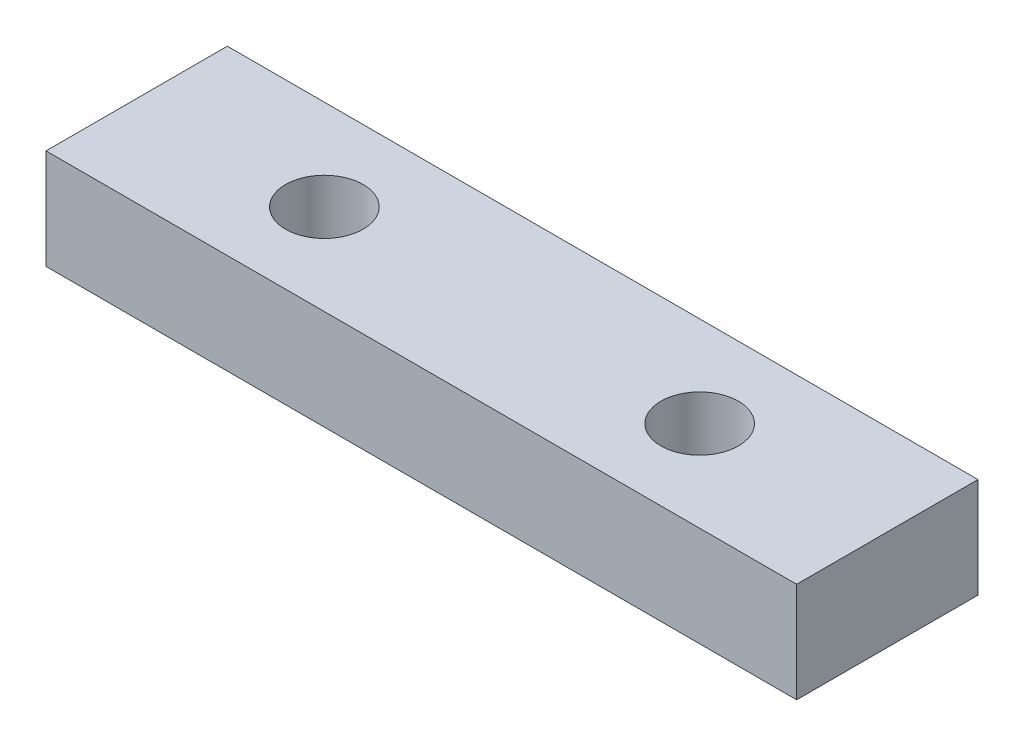
ISO-10303-21;
HEADER;
FILE_DESCRIPTION(('STEP AP214'),'2;1');
FILE_NAME('part.step','',(''),(''),'','','');
FILE_SCHEMA(('AUTOMOTIVE_DESIGN { 1 0 10303 214 1 1 1 1 }'));
ENDSEC;
DATA;
#1=APPLICATION_CONTEXT('core data for automotive mechanical design processes');
#2=APPLICATION_PROTOCOL_DEFINITION('international standard','automotive_design',2000,#1);
#3=PRODUCT_CONTEXT('',#1,'mechanical');
#4=PRODUCT('Part','Part','',(#3));
#5=PRODUCT_RELATED_PRODUCT_CATEGORY('part','',(#4));
#6=PRODUCT_DEFINITION_FORMATION('','',#4);
#7=PRODUCT_DEFINITION_CONTEXT('part definition',#1,'design');
#8=PRODUCT_DEFINITION('design','',#6,#7);
#9=PRODUCT_DEFINITION_SHAPE('','',#8);
#10=(LENGTH_UNIT() NAMED_UNIT(*) SI_UNIT(.MILLI.,.METRE.));
#11=(NAMED_UNIT(*) PLANE_ANGLE_UNIT() SI_UNIT($,.RADIAN.));
#12=(NAMED_UNIT(*) SI_UNIT($,.STERADIAN.) SOLID_ANGLE_UNIT());
#13=UNCERTAINTY_MEASURE_WITH_UNIT(LENGTH_MEASURE(1.E-05),#10,'distance_accuracy_value','');
#14=(GEOMETRIC_REPRESENTATION_CONTEXT(3) GLOBAL_UNCERTAINTY_ASSIGNED_CONTEXT((#13)) GLOBAL_UNIT_ASSIGNED_CONTEXT((#10,
#11,#12)) REPRESENTATION_CONTEXT('',''));
#15=CARTESIAN_POINT('',(0.,0.,0.));
#16=DIRECTION('',(0.,0.,1.));
#17=DIRECTION('',(1.,0.,0.));
#18=AXIS2_PLACEMENT_3D('',#15,#16,#17);
#19=CARTESIAN_POINT('',(0.,4.,0.));
#20=DIRECTION('',(0.,1.,0.));
#21=DIRECTION('',(0.,0.,1.));
#22=AXIS2_PLACEMENT_3D('',#19,#20,#21);
#23=PLANE('',#22);
#24=CARTESIAN_POINT('',(-7.5,4.,3.62393862904471));
#25=DIRECTION('',(0.,1.,0.));
#26=DIRECTION('',(0.,0.,1.));
#27=AXIS2_PLACEMENT_3D('',#24,#25,#26);
#28=CIRCLE('',#27,1.55);
#29=CARTESIAN_POINT('',(-7.5,4.,5.17393862904471));
#30=VERTEX_POINT('',#29);
#31=EDGE_CURVE('E131',#30,#30,#28,.T.);
#32=ORIENTED_EDGE('',*,*,#31,.F.);
#33=EDGE_LOOP('',(#32));
#34=FACE_BOUND('',#33,.T.);
#35=DIRECTION('',(0.,0.,1.));
#36=VECTOR('',#35,1.);
#37=CARTESIAN_POINT('',(-14.999999999999,4.,0.));
#38=LINE('',#37,#36);
#39=CARTESIAN_POINT('',(-14.999999999999,4.,0.));
#40=VERTEX_POINT('',#39);
#41=CARTESIAN_POINT('',(-14.999999999999,4.,7.24787725808921));
#42=VERTEX_POINT('',#41);
#43=EDGE_CURVE('E115',#40,#42,#38,.T.);
#44=ORIENTED_EDGE('',*,*,#43,.T.);
#45=DIRECTION('',(1.,0.,0.));
#46=VECTOR('',#45,1.);
#47=CARTESIAN_POINT('',(-14.999999999999,4.,7.24787725808921));
#48=LINE('',#47,#46);
#49=CARTESIAN_POINT('',(14.999999999999,4.,7.24787725808921));
#50=VERTEX_POINT('',#49);
#51=EDGE_CURVE('E107',#42,#50,#48,.T.);
#52=ORIENTED_EDGE('',*,*,#51,.T.);
#53=DIRECTION('',(0.,0.,1.));
#54=VECTOR('',#53,1.);
#55=CARTESIAN_POINT('',(14.999999999999,4.,0.));
#56=LINE('',#55,#54);
#57=CARTESIAN_POINT('',(14.999999999999,4.,0.));
#58=VERTEX_POINT('',#57);
#59=EDGE_CURVE('E114',#58,#50,#56,.T.);
#60=ORIENTED_EDGE('',*,*,#59,.F.);
#61=DIRECTION('',(1.,0.,0.));
#62=VECTOR('',#61,1.);
#63=CARTESIAN_POINT('',(-14.999999999999,4.,0.));
#64=LINE('',#63,#62);
#65=EDGE_CURVE('E124',#40,#58,#64,.T.);
#66=ORIENTED_EDGE('',*,*,#65,.F.);
#67=EDGE_LOOP('',(#44,#52,#60,#66));
#68=FACE_BOUND('',#67,.T.);
#69=CARTESIAN_POINT('',(7.5,4.,3.62393862904471));
#70=DIRECTION('',(0.,1.,0.));
#71=DIRECTION('',(0.,0.,1.));
#72=AXIS2_PLACEMENT_3D('',#69,#70,#71);
#73=CIRCLE('',#72,1.55);
#74=CARTESIAN_POINT('',(7.5,4.,5.17393862904471));
#75=VERTEX_POINT('',#74);
#76=EDGE_CURVE('E144',#75,#75,#73,.T.);
#77=ORIENTED_EDGE('',*,*,#76,.F.);
#78=EDGE_LOOP('',(#77));
#79=FACE_BOUND('',#78,.T.);
#80=ADVANCED_FACE('F65',(#34,#68,#79),#23,.T.);
#81=CARTESIAN_POINT('',(0.,0.,0.));
#82=DIRECTION('',(0.,1.,0.));
#83=DIRECTION('',(0.,0.,1.));
#84=AXIS2_PLACEMENT_3D('',#81,#82,#83);
#85=PLANE('',#84);
#86=CARTESIAN_POINT('',(-7.5,0.,3.62393862904471));
#87=DIRECTION('',(0.,1.,0.));
#88=DIRECTION('',(0.,0.,1.));
#89=AXIS2_PLACEMENT_3D('',#86,#87,#88);
#90=CIRCLE('',#89,1.55);
#91=CARTESIAN_POINT('',(-7.5,0.,5.17393862904471));
#92=VERTEX_POINT('',#91);
#93=EDGE_CURVE('E141',#92,#92,#90,.T.);
#94=ORIENTED_EDGE('',*,*,#93,.T.);
#95=EDGE_LOOP('',(#94));
#96=FACE_BOUND('',#95,.T.);
#97=DIRECTION('',(0.,0.,1.));
#98=VECTOR('',#97,1.);
#99=CARTESIAN_POINT('',(-14.999999999999,0.,0.));
#100=LINE('',#99,#98);
#101=CARTESIAN_POINT('',(-14.999999999999,0.,0.));
#102=VERTEX_POINT('',#101);
#103=CARTESIAN_POINT('',(-14.999999999999,0.,7.24787725808921));
#104=VERTEX_POINT('',#103);
#105=EDGE_CURVE('E129',#102,#104,#100,.T.);
#106=ORIENTED_EDGE('',*,*,#105,.F.);
#107=DIRECTION('',(1.,0.,0.));
#108=VECTOR('',#107,1.);
#109=CARTESIAN_POINT('',(-14.999999999999,0.,0.));
#110=LINE('',#109,#108);
#111=CARTESIAN_POINT('',(14.999999999999,0.,0.));
#112=VERTEX_POINT('',#111);
#113=EDGE_CURVE('E135',#102,#112,#110,.T.);
#114=ORIENTED_EDGE('',*,*,#113,.T.);
#115=DIRECTION('',(0.,0.,1.));
#116=VECTOR('',#115,1.);
#117=CARTESIAN_POINT('',(14.999999999999,0.,0.));
#118=LINE('',#117,#116);
#119=CARTESIAN_POINT('',(14.999999999999,0.,7.24787725808921));
#120=VERTEX_POINT('',#119);
#121=EDGE_CURVE('E133',#112,#120,#118,.T.);
#122=ORIENTED_EDGE('',*,*,#121,.T.);
#123=DIRECTION('',(1.,0.,0.));
#124=VECTOR('',#123,1.);
#125=CARTESIAN_POINT('',(-14.999999999999,0.,7.24787725808921));
#126=LINE('',#125,#124);
#127=EDGE_CURVE('E120',#104,#120,#126,.T.);
#128=ORIENTED_EDGE('',*,*,#127,.F.);
#129=EDGE_LOOP('',(#106,#114,#122,#128));
#130=FACE_BOUND('',#129,.T.);
#131=CARTESIAN_POINT('',(7.5,0.,3.62393862904471));
#132=DIRECTION('',(0.,1.,0.));
#133=DIRECTION('',(0.,0.,1.));
#134=AXIS2_PLACEMENT_3D('',#131,#132,#133);
#135=CIRCLE('',#134,1.55);
#136=CARTESIAN_POINT('',(7.5,0.,5.17393862904471));
#137=VERTEX_POINT('',#136);
#138=EDGE_CURVE('E147',#137,#137,#135,.T.);
#139=ORIENTED_EDGE('',*,*,#138,.T.);
#140=EDGE_LOOP('',(#139));
#141=FACE_BOUND('',#140,.T.);
#142=ADVANCED_FACE('F156',(#96,#130,#141),#85,.F.);
#143=CARTESIAN_POINT('',(-14.999999999999,4.,0.));
#144=DIRECTION('',(1.,0.,0.));
#145=DIRECTION('',(0.,0.,-1.));
#146=AXIS2_PLACEMENT_3D('',#143,#144,#145);
#147=PLANE('',#146);
#148=ORIENTED_EDGE('',*,*,#105,.T.);
#149=DIRECTION('',(0.,-1.,0.));
#150=VECTOR('',#149,1.);
#151=CARTESIAN_POINT('',(-14.999999999999,4.,7.24787725808921));
#152=LINE('',#151,#150);
#153=EDGE_CURVE('E12',#42,#104,#152,.T.);
#154=ORIENTED_EDGE('',*,*,#153,.F.);
#155=ORIENTED_EDGE('',*,*,#43,.F.);
#156=DIRECTION('',(0.,-1.,0.));
#157=VECTOR('',#156,1.);
#158=CARTESIAN_POINT('',(-14.999999999999,4.,0.));
#159=LINE('',#158,#157);
#160=EDGE_CURVE('E82',#40,#102,#159,.T.);
#161=ORIENTED_EDGE('',*,*,#160,.T.);
#162=EDGE_LOOP('',(#148,#154,#155,#161));
#163=FACE_BOUND('',#162,.T.);
#164=ADVANCED_FACE('F67',(#163),#147,.F.);
#165=CARTESIAN_POINT('',(-14.999999999999,4.,7.24787725808921));
#166=DIRECTION('',(0.,0.,-1.));
#167=DIRECTION('',(-1.,0.,0.));
#168=AXIS2_PLACEMENT_3D('',#165,#166,#167);
#169=PLANE('',#168);
#170=ORIENTED_EDGE('',*,*,#127,.T.);
#171=DIRECTION('',(0.,-1.,0.));
#172=VECTOR('',#171,1.);
#173=CARTESIAN_POINT('',(14.999999999999,4.,7.24787725808921));
#174=LINE('',#173,#172);
#175=EDGE_CURVE('E74',#50,#120,#174,.T.);
#176=ORIENTED_EDGE('',*,*,#175,.F.);
#177=ORIENTED_EDGE('',*,*,#51,.F.);
#178=ORIENTED_EDGE('',*,*,#153,.T.);
#179=EDGE_LOOP('',(#170,#176,#177,#178));
#180=FACE_BOUND('',#179,.T.);
#181=ADVANCED_FACE('F119',(#180),#169,.F.);
#182=CARTESIAN_POINT('',(14.999999999999,4.,0.));
#183=DIRECTION('',(1.,0.,0.));
#184=DIRECTION('',(0.,0.,-1.));
#185=AXIS2_PLACEMENT_3D('',#182,#183,#184);
#186=PLANE('',#185);
#187=ORIENTED_EDGE('',*,*,#121,.F.);
#188=DIRECTION('',(0.,-1.,0.));
#189=VECTOR('',#188,1.);
#190=CARTESIAN_POINT('',(14.999999999999,4.,0.));
#191=LINE('',#190,#189);
#192=EDGE_CURVE('E96',#58,#112,#191,.T.);
#193=ORIENTED_EDGE('',*,*,#192,.F.);
#194=ORIENTED_EDGE('',*,*,#59,.T.);
#195=ORIENTED_EDGE('',*,*,#175,.T.);
#196=EDGE_LOOP('',(#187,#193,#194,#195));
#197=FACE_BOUND('',#196,.T.);
#198=ADVANCED_FACE('F123',(#197),#186,.T.);
#199=CARTESIAN_POINT('',(-14.999999999999,4.,0.));
#200=DIRECTION('',(0.,0.,-1.));
#201=DIRECTION('',(-1.,0.,0.));
#202=AXIS2_PLACEMENT_3D('',#199,#200,#201);
#203=PLANE('',#202);
#204=ORIENTED_EDGE('',*,*,#113,.F.);
#205=ORIENTED_EDGE('',*,*,#160,.F.);
#206=ORIENTED_EDGE('',*,*,#65,.T.);
#207=ORIENTED_EDGE('',*,*,#192,.T.);
#208=EDGE_LOOP('',(#204,#205,#206,#207));
#209=FACE_BOUND('',#208,.T.);
#210=ADVANCED_FACE('F169',(#209),#203,.T.);
#211=CARTESIAN_POINT('',(-7.5,4.,3.62393862904471));
#212=DIRECTION('',(0.,-1.,0.));
#213=DIRECTION('',(0.,0.,-1.));
#214=AXIS2_PLACEMENT_3D('',#211,#212,#213);
#215=CYLINDRICAL_SURFACE('',#214,1.55);
#216=ORIENTED_EDGE('',*,*,#31,.T.);
#217=EDGE_LOOP('',(#216));
#218=FACE_BOUND('',#217,.T.);
#219=ORIENTED_EDGE('',*,*,#93,.F.);
#220=EDGE_LOOP('',(#219));
#221=FACE_BOUND('',#220,.T.);
#222=ADVANCED_FACE('F166',(#218,#221),#215,.F.);
#223=CARTESIAN_POINT('',(7.5,4.,3.62393862904471));
#224=DIRECTION('',(0.,-1.,0.));
#225=DIRECTION('',(0.,0.,-1.));
#226=AXIS2_PLACEMENT_3D('',#223,#224,#225);
#227=CYLINDRICAL_SURFACE('',#226,1.55);
#228=ORIENTED_EDGE('',*,*,#76,.T.);
#229=EDGE_LOOP('',(#228));
#230=FACE_BOUND('',#229,.T.);
#231=ORIENTED_EDGE('',*,*,#138,.F.);
#232=EDGE_LOOP('',(#231));
#233=FACE_BOUND('',#232,.T.);
#234=ADVANCED_FACE('F153',(#230,#233),#227,.F.);
#235=CLOSED_SHELL('',(#80,#142,#164,#181,#198,#210,#222,#234));
#236=MANIFOLD_SOLID_BREP('B2',#235);
#237=ADVANCED_BREP_SHAPE_REPRESENTATION('',(#18,#236),#14);
#238=SHAPE_DEFINITION_REPRESENTATION(#9,#237);
ENDSEC;
END-ISO-10303-21;
